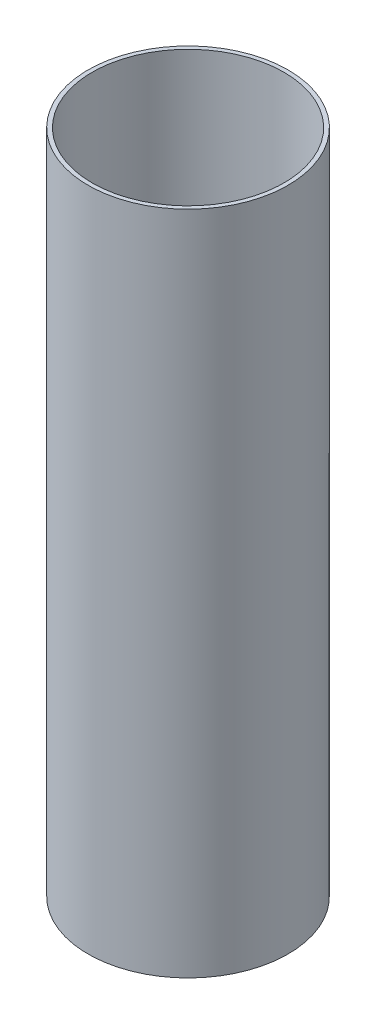
ISO-10303-21;
HEADER;
FILE_DESCRIPTION(('STEP AP214'),'2;1');
FILE_NAME('part.step','',(''),(''),'','','');
FILE_SCHEMA(('AUTOMOTIVE_DESIGN { 1 0 10303 214 1 1 1 1 }'));
ENDSEC;
DATA;
#1=APPLICATION_CONTEXT('core data for automotive mechanical design processes');
#2=APPLICATION_PROTOCOL_DEFINITION('international standard','automotive_design',2000,#1);
#3=PRODUCT_CONTEXT('',#1,'mechanical');
#4=PRODUCT('Part','Part','',(#3));
#5=PRODUCT_RELATED_PRODUCT_CATEGORY('part','',(#4));
#6=PRODUCT_DEFINITION_FORMATION('','',#4);
#7=PRODUCT_DEFINITION_CONTEXT('part definition',#1,'design');
#8=PRODUCT_DEFINITION('design','',#6,#7);
#9=PRODUCT_DEFINITION_SHAPE('','',#8);
#10=(LENGTH_UNIT() NAMED_UNIT(*) SI_UNIT(.MILLI.,.METRE.));
#11=(NAMED_UNIT(*) PLANE_ANGLE_UNIT() SI_UNIT($,.RADIAN.));
#12=(NAMED_UNIT(*) SI_UNIT($,.STERADIAN.) SOLID_ANGLE_UNIT());
#13=UNCERTAINTY_MEASURE_WITH_UNIT(LENGTH_MEASURE(1.E-05),#10,'distance_accuracy_value','');
#14=(GEOMETRIC_REPRESENTATION_CONTEXT(3) GLOBAL_UNCERTAINTY_ASSIGNED_CONTEXT((#13)) GLOBAL_UNIT_ASSIGNED_CONTEXT((#10,
#11,#12)) REPRESENTATION_CONTEXT('',''));
#15=CARTESIAN_POINT('',(0.,0.,0.));
#16=DIRECTION('',(0.,0.,1.));
#17=DIRECTION('',(1.,0.,0.));
#18=AXIS2_PLACEMENT_3D('',#15,#16,#17);
#19=CARTESIAN_POINT('',(0.,0.,0.));
#20=DIRECTION('',(0.,-1.,0.));
#21=DIRECTION('',(0.,0.,-1.));
#22=AXIS2_PLACEMENT_3D('',#19,#20,#21);
#23=CYLINDRICAL_SURFACE('',#22,26.9875);
#24=CARTESIAN_POINT('',(0.,-217.16660001479,0.));
#25=DIRECTION('',(0.,-1.,0.));
#26=DIRECTION('',(0.,0.,-1.));
#27=AXIS2_PLACEMENT_3D('',#24,#25,#26);
#28=CIRCLE('',#27,26.9875);
#29=CARTESIAN_POINT('',(0.,-217.16660001479,-26.9875));
#30=VERTEX_POINT('',#29);
#31=EDGE_CURVE('E10',#30,#30,#28,.T.);
#32=ORIENTED_EDGE('',*,*,#31,.T.);
#33=EDGE_LOOP('',(#32));
#34=FACE_BOUND('',#33,.T.);
#35=CARTESIAN_POINT('',(0.,-29.8416000147903,0.));
#36=DIRECTION('',(0.,-1.,0.));
#37=DIRECTION('',(0.,0.,-1.));
#38=AXIS2_PLACEMENT_3D('',#35,#36,#37);
#39=CIRCLE('',#38,26.9875);
#40=CARTESIAN_POINT('',(0.,-29.8416000147903,-26.9875));
#41=VERTEX_POINT('',#40);
#42=EDGE_CURVE('E51',#41,#41,#39,.T.);
#43=ORIENTED_EDGE('',*,*,#42,.F.);
#44=EDGE_LOOP('',(#43));
#45=FACE_BOUND('',#44,.T.);
#46=ADVANCED_FACE('F37',(#34,#45),#23,.F.);
#47=CARTESIAN_POINT('',(26.9875,-217.16660001479,0.));
#48=DIRECTION('',(0.,-1.,0.));
#49=DIRECTION('',(0.,0.,-1.));
#50=AXIS2_PLACEMENT_3D('',#47,#48,#49);
#51=PLANE('',#50);
#52=CARTESIAN_POINT('',(0.,-217.16660001479,0.));
#53=DIRECTION('',(0.,-1.,0.));
#54=DIRECTION('',(0.,0.,-1.));
#55=AXIS2_PLACEMENT_3D('',#52,#53,#54);
#56=CIRCLE('',#55,28.1305000000001);
#57=CARTESIAN_POINT('',(0.,-217.16660001479,-28.1305000000001));
#58=VERTEX_POINT('',#57);
#59=EDGE_CURVE('E43',#58,#58,#56,.T.);
#60=ORIENTED_EDGE('',*,*,#59,.T.);
#61=EDGE_LOOP('',(#60));
#62=FACE_BOUND('',#61,.T.);
#63=ORIENTED_EDGE('',*,*,#31,.F.);
#64=EDGE_LOOP('',(#63));
#65=FACE_BOUND('',#64,.T.);
#66=ADVANCED_FACE('F61',(#62,#65),#51,.T.);
#67=CARTESIAN_POINT('',(0.,0.,0.));
#68=DIRECTION('',(0.,-1.,0.));
#69=DIRECTION('',(0.,0.,-1.));
#70=AXIS2_PLACEMENT_3D('',#67,#68,#69);
#71=CYLINDRICAL_SURFACE('',#70,28.1305000000001);
#72=CARTESIAN_POINT('',(0.,-29.8416000147903,0.));
#73=DIRECTION('',(0.,-1.,0.));
#74=DIRECTION('',(0.,0.,-1.));
#75=AXIS2_PLACEMENT_3D('',#72,#73,#74);
#76=CIRCLE('',#75,28.1305000000001);
#77=CARTESIAN_POINT('',(0.,-29.8416000147903,-28.1305000000001));
#78=VERTEX_POINT('',#77);
#79=EDGE_CURVE('E47',#78,#78,#76,.T.);
#80=ORIENTED_EDGE('',*,*,#79,.T.);
#81=EDGE_LOOP('',(#80));
#82=FACE_BOUND('',#81,.T.);
#83=ORIENTED_EDGE('',*,*,#59,.F.);
#84=EDGE_LOOP('',(#83));
#85=FACE_BOUND('',#84,.T.);
#86=ADVANCED_FACE('F65',(#82,#85),#71,.T.);
#87=CARTESIAN_POINT('',(26.9875,-29.8416000147903,0.));
#88=DIRECTION('',(0.,1.,0.));
#89=DIRECTION('',(0.,0.,1.));
#90=AXIS2_PLACEMENT_3D('',#87,#88,#89);
#91=PLANE('',#90);
#92=ORIENTED_EDGE('',*,*,#42,.T.);
#93=EDGE_LOOP('',(#92));
#94=FACE_BOUND('',#93,.T.);
#95=ORIENTED_EDGE('',*,*,#79,.F.);
#96=EDGE_LOOP('',(#95));
#97=FACE_BOUND('',#96,.T.);
#98=ADVANCED_FACE('F57',(#94,#97),#91,.T.);
#99=CLOSED_SHELL('',(#46,#66,#86,#98));
#100=MANIFOLD_SOLID_BREP('B2',#99);
#101=ADVANCED_BREP_SHAPE_REPRESENTATION('',(#18,#100),#14);
#102=SHAPE_DEFINITION_REPRESENTATION(#9,#101);
ENDSEC;
END-ISO-10303-21;
